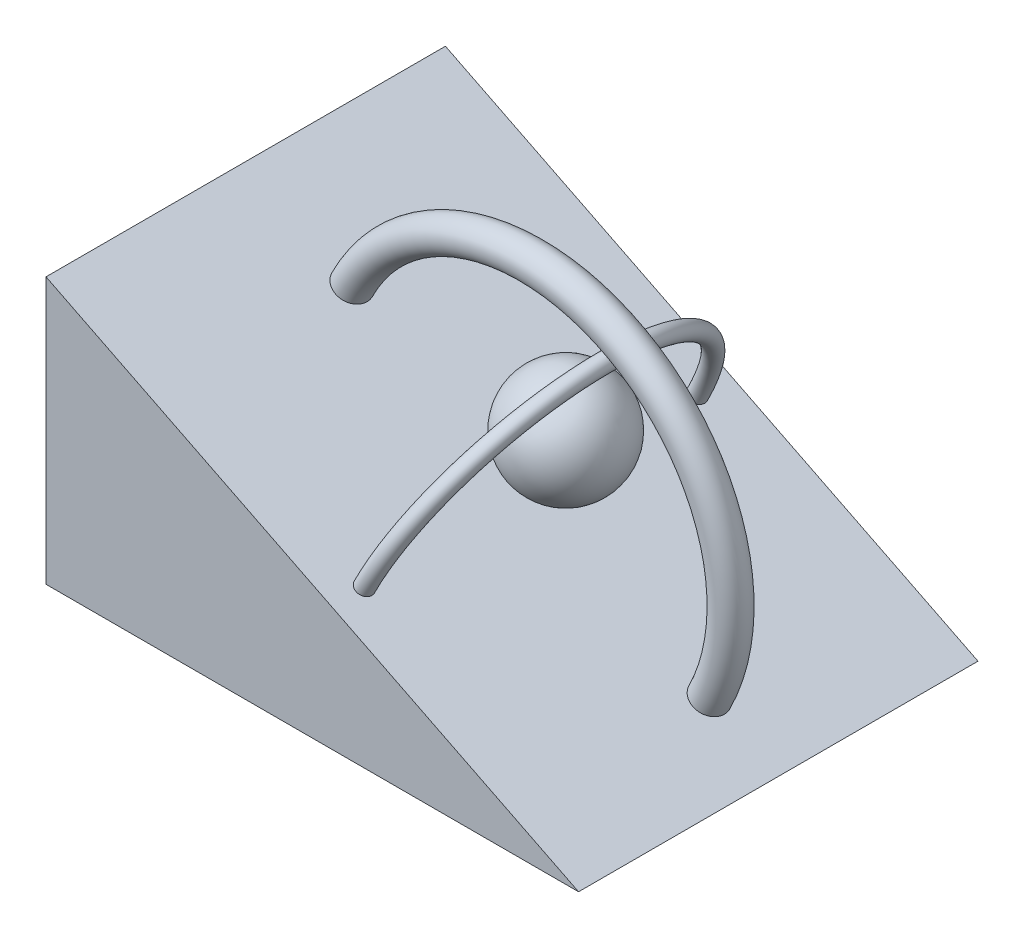
ISO-10303-21;
HEADER;
FILE_DESCRIPTION(('STEP AP214'),'2;1');
FILE_NAME('part.step','',(''),(''),'','','');
FILE_SCHEMA(('AUTOMOTIVE_DESIGN { 1 0 10303 214 1 1 1 1 }'));
ENDSEC;
DATA;
#1=APPLICATION_CONTEXT('core data for automotive mechanical design processes');
#2=APPLICATION_PROTOCOL_DEFINITION('international standard','automotive_design',2000,#1);
#3=PRODUCT_CONTEXT('',#1,'mechanical');
#4=PRODUCT('Part','Part','',(#3));
#5=PRODUCT_RELATED_PRODUCT_CATEGORY('part','',(#4));
#6=PRODUCT_DEFINITION_FORMATION('','',#4);
#7=PRODUCT_DEFINITION_CONTEXT('part definition',#1,'design');
#8=PRODUCT_DEFINITION('design','',#6,#7);
#9=PRODUCT_DEFINITION_SHAPE('','',#8);
#10=(LENGTH_UNIT() NAMED_UNIT(*) SI_UNIT(.MILLI.,.METRE.));
#11=(NAMED_UNIT(*) PLANE_ANGLE_UNIT() SI_UNIT($,.RADIAN.));
#12=(NAMED_UNIT(*) SI_UNIT($,.STERADIAN.) SOLID_ANGLE_UNIT());
#13=UNCERTAINTY_MEASURE_WITH_UNIT(LENGTH_MEASURE(1.E-05),#10,'distance_accuracy_value','');
#14=(GEOMETRIC_REPRESENTATION_CONTEXT(3) GLOBAL_UNCERTAINTY_ASSIGNED_CONTEXT((#13)) GLOBAL_UNIT_ASSIGNED_CONTEXT((#10,
#11,#12)) REPRESENTATION_CONTEXT('',''));
#15=CARTESIAN_POINT('',(0.,0.,0.));
#16=DIRECTION('',(0.,0.,1.));
#17=DIRECTION('',(1.,0.,0.));
#18=AXIS2_PLACEMENT_3D('',#15,#16,#17);
#19=CARTESIAN_POINT('',(61.0517561148393,36.9093222869366,0.));
#20=DIRECTION('',(0.447213595499958,0.894427190999916,0.));
#21=DIRECTION('',(0.,0.,-1.));
#22=AXIS2_PLACEMENT_3D('',#19,#20,#21);
#23=SPHERICAL_SURFACE('',#22,10.5210244842766);
#24=CARTESIAN_POINT('',(57.7247160459681,30.2552421491942,0.));
#25=DIRECTION('',(0.447213595499958,0.894427190999916,0.));
#26=DIRECTION('',(-0.894427190999916,0.447213595499958,0.));
#27=AXIS2_PLACEMENT_3D('',#24,#25,#26);
#28=CIRCLE('',#27,7.4394877578617);
#29=CARTESIAN_POINT('',(51.0706359082256,33.5822822180655,0.));
#30=VERTEX_POINT('',#29);
#31=EDGE_CURVE('E12',#30,#30,#28,.T.);
#32=ORIENTED_EDGE('',*,*,#31,.T.);
#33=EDGE_LOOP('',(#32));
#34=FACE_BOUND('',#33,.T.);
#35=ADVANCED_FACE('F53',(#34),#23,.T.);
#36=CARTESIAN_POINT('',(54.3976759770968,23.6011620114516,0.));
#37=DIRECTION('',(0.447213595499958,0.894427190999916,0.));
#38=DIRECTION('',(-0.894427190999916,0.447213595499958,0.));
#39=AXIS2_PLACEMENT_3D('',#36,#37,#38);
#40=CONICAL_SURFACE('',#39,0.,0.785398163397441);
#41=ORIENTED_EDGE('',*,*,#31,.F.);
#42=EDGE_LOOP('',(#41));
#43=FACE_BOUND('',#42,.T.);
#44=CARTESIAN_POINT('',(54.3976759770968,23.6011620114516,0.));
#45=VERTEX_POINT('',#44);
#46=VERTEX_LOOP('',#45);
#47=FACE_BOUND('',#46,.T.);
#48=ADVANCED_FACE('F60',(#43,#47),#40,.T.);
#49=CLOSED_SHELL('',(#35,#48));
#50=MANIFOLD_SOLID_BREP('B2',#49);
#51=CARTESIAN_POINT('',(101.6,0.,-38.1));
#52=DIRECTION('',(0.,-1.,0.));
#53=DIRECTION('',(0.,0.,-1.));
#54=AXIS2_PLACEMENT_3D('',#51,#52,#53);
#55=PLANE('',#54);
#56=DIRECTION('',(1.,0.,0.));
#57=VECTOR('',#56,1.);
#58=CARTESIAN_POINT('',(101.6,0.,38.1));
#59=LINE('',#58,#57);
#60=CARTESIAN_POINT('',(0.,0.,38.1));
#61=VERTEX_POINT('',#60);
#62=CARTESIAN_POINT('',(101.6,0.,38.1));
#63=VERTEX_POINT('',#62);
#64=EDGE_CURVE('E157',#61,#63,#59,.T.);
#65=ORIENTED_EDGE('',*,*,#64,.F.);
#66=DIRECTION('',(0.,0.,1.));
#67=VECTOR('',#66,1.);
#68=CARTESIAN_POINT('',(0.,0.,-38.1));
#69=LINE('',#68,#67);
#70=CARTESIAN_POINT('',(0.,0.,-38.1));
#71=VERTEX_POINT('',#70);
#72=EDGE_CURVE('E118',#71,#61,#69,.T.);
#73=ORIENTED_EDGE('',*,*,#72,.F.);
#74=DIRECTION('',(1.,0.,0.));
#75=VECTOR('',#74,1.);
#76=CARTESIAN_POINT('',(101.6,0.,-38.1));
#77=LINE('',#76,#75);
#78=CARTESIAN_POINT('',(101.6,0.,-38.1));
#79=VERTEX_POINT('',#78);
#80=EDGE_CURVE('E149',#71,#79,#77,.T.);
#81=ORIENTED_EDGE('',*,*,#80,.T.);
#82=DIRECTION('',(0.,0.,1.));
#83=VECTOR('',#82,1.);
#84=CARTESIAN_POINT('',(101.6,0.,-38.1));
#85=LINE('',#84,#83);
#86=EDGE_CURVE('E138',#79,#63,#85,.T.);
#87=ORIENTED_EDGE('',*,*,#86,.T.);
#88=EDGE_LOOP('',(#65,#73,#81,#87));
#89=FACE_BOUND('',#88,.T.);
#90=ADVANCED_FACE('F102',(#89),#55,.T.);
#91=CARTESIAN_POINT('',(0.,0.,-38.1));
#92=DIRECTION('',(-1.,0.,0.));
#93=DIRECTION('',(0.,0.,1.));
#94=AXIS2_PLACEMENT_3D('',#91,#92,#93);
#95=PLANE('',#94);
#96=DIRECTION('',(0.,-1.,0.));
#97=VECTOR('',#96,1.);
#98=CARTESIAN_POINT('',(0.,0.,38.1));
#99=LINE('',#98,#97);
#100=CARTESIAN_POINT('',(0.,50.8,38.1));
#101=VERTEX_POINT('',#100);
#102=EDGE_CURVE('E151',#101,#61,#99,.T.);
#103=ORIENTED_EDGE('',*,*,#102,.F.);
#104=DIRECTION('',(0.,0.,1.));
#105=VECTOR('',#104,1.);
#106=CARTESIAN_POINT('',(0.,50.8,-38.1));
#107=LINE('',#106,#105);
#108=CARTESIAN_POINT('',(0.,50.8,-38.1));
#109=VERTEX_POINT('',#108);
#110=EDGE_CURVE('E132',#109,#101,#107,.T.);
#111=ORIENTED_EDGE('',*,*,#110,.F.);
#112=DIRECTION('',(0.,-1.,0.));
#113=VECTOR('',#112,1.);
#114=CARTESIAN_POINT('',(0.,0.,-38.1));
#115=LINE('',#114,#113);
#116=EDGE_CURVE('E145',#109,#71,#115,.T.);
#117=ORIENTED_EDGE('',*,*,#116,.T.);
#118=ORIENTED_EDGE('',*,*,#72,.T.);
#119=EDGE_LOOP('',(#103,#111,#117,#118));
#120=FACE_BOUND('',#119,.T.);
#121=ADVANCED_FACE('F174',(#120),#95,.T.);
#122=CARTESIAN_POINT('',(0.,50.8,-38.1));
#123=DIRECTION('',(0.447213595499958,0.894427190999916,0.));
#124=DIRECTION('',(-0.894427190999916,0.447213595499958,0.));
#125=AXIS2_PLACEMENT_3D('',#122,#123,#124);
#126=PLANE('',#125);
#127=CARTESIAN_POINT('',(54.3976759770968,23.6011620114516,-31.75));
#128=DIRECTION('',(0.447213595499958,0.894427190999916,0.));
#129=DIRECTION('',(-0.894427190999916,0.447213595499958,0.));
#130=AXIS2_PLACEMENT_3D('',#127,#128,#129);
#131=CIRCLE('',#130,1.5875);
#132=CARTESIAN_POINT('',(54.3976759770968,23.6011620114516,-33.3375));
#133=VERTEX_POINT('',#132);
#134=EDGE_CURVE('E51',#133,#133,#131,.T.);
#135=ORIENTED_EDGE('',*,*,#134,.F.);
#136=EDGE_LOOP('',(#135));
#137=FACE_BOUND('',#136,.T.);
#138=CARTESIAN_POINT('',(54.3976759770968,23.6011620114516,31.75));
#139=DIRECTION('',(0.447213595499958,0.894427190999916,0.));
#140=DIRECTION('',(-0.894427190999916,0.447213595499958,0.));
#141=AXIS2_PLACEMENT_3D('',#138,#139,#140);
#142=CIRCLE('',#141,1.5875);
#143=CARTESIAN_POINT('',(54.3976759770968,23.6011620114516,33.3375));
#144=VERTEX_POINT('',#143);
#145=EDGE_CURVE('E110',#144,#144,#142,.T.);
#146=ORIENTED_EDGE('',*,*,#145,.F.);
#147=EDGE_LOOP('',(#146));
#148=FACE_BOUND('',#147,.T.);
#149=CARTESIAN_POINT('',(88.4753519541936,6.5623240229032,0.));
#150=DIRECTION('',(0.447213595499958,0.894427190999916,0.));
#151=DIRECTION('',(-0.894427190999916,0.447213595499958,0.));
#152=AXIS2_PLACEMENT_3D('',#149,#150,#151);
#153=CIRCLE('',#152,3.175);
#154=CARTESIAN_POINT('',(91.3151582856183,5.14242085719084,0.));
#155=VERTEX_POINT('',#154);
#156=EDGE_CURVE('E165',#155,#155,#153,.T.);
#157=ORIENTED_EDGE('',*,*,#156,.F.);
#158=EDGE_LOOP('',(#157));
#159=FACE_BOUND('',#158,.T.);
#160=CARTESIAN_POINT('',(20.32,40.64,0.));
#161=DIRECTION('',(0.447213595499958,0.894427190999916,0.));
#162=DIRECTION('',(-0.894427190999916,0.447213595499958,0.));
#163=AXIS2_PLACEMENT_3D('',#160,#161,#162);
#164=CIRCLE('',#163,3.175);
#165=CARTESIAN_POINT('',(17.4801936685753,42.0599031657124,0.));
#166=VERTEX_POINT('',#165);
#167=EDGE_CURVE('E161',#166,#166,#164,.T.);
#168=ORIENTED_EDGE('',*,*,#167,.F.);
#169=EDGE_LOOP('',(#168));
#170=FACE_BOUND('',#169,.T.);
#171=DIRECTION('',(-0.894427190999916,0.447213595499958,0.));
#172=VECTOR('',#171,1.);
#173=CARTESIAN_POINT('',(0.,50.8,38.1));
#174=LINE('',#173,#172);
#175=EDGE_CURVE('E143',#63,#101,#174,.T.);
#176=ORIENTED_EDGE('',*,*,#175,.F.);
#177=ORIENTED_EDGE('',*,*,#86,.F.);
#178=DIRECTION('',(-0.894427190999916,0.447213595499958,0.));
#179=VECTOR('',#178,1.);
#180=CARTESIAN_POINT('',(0.,50.8,-38.1));
#181=LINE('',#180,#179);
#182=EDGE_CURVE('E141',#79,#109,#181,.T.);
#183=ORIENTED_EDGE('',*,*,#182,.T.);
#184=ORIENTED_EDGE('',*,*,#110,.T.);
#185=EDGE_LOOP('',(#176,#177,#183,#184));
#186=FACE_BOUND('',#185,.T.);
#187=ADVANCED_FACE('F140',(#137,#148,#159,#170,#186),#126,.T.);
#188=CARTESIAN_POINT('',(0.,0.,-38.1));
#189=DIRECTION('',(0.,0.,-1.));
#190=DIRECTION('',(-1.,0.,0.));
#191=AXIS2_PLACEMENT_3D('',#188,#189,#190);
#192=PLANE('',#191);
#193=ORIENTED_EDGE('',*,*,#80,.F.);
#194=ORIENTED_EDGE('',*,*,#116,.F.);
#195=ORIENTED_EDGE('',*,*,#182,.F.);
#196=EDGE_LOOP('',(#193,#194,#195));
#197=FACE_BOUND('',#196,.T.);
#198=ADVANCED_FACE('F148',(#197),#192,.T.);
#199=CARTESIAN_POINT('',(0.,0.,38.1));
#200=DIRECTION('',(0.,0.,-1.));
#201=DIRECTION('',(-1.,0.,0.));
#202=AXIS2_PLACEMENT_3D('',#199,#200,#201);
#203=PLANE('',#202);
#204=ORIENTED_EDGE('',*,*,#64,.T.);
#205=ORIENTED_EDGE('',*,*,#175,.T.);
#206=ORIENTED_EDGE('',*,*,#102,.T.);
#207=EDGE_LOOP('',(#204,#205,#206));
#208=FACE_BOUND('',#207,.T.);
#209=ADVANCED_FACE('F182',(#208),#203,.F.);
#210=CARTESIAN_POINT('',(54.3976759770968,23.6011620114516,0.));
#211=DIRECTION('',(0.,0.,-1.));
#212=DIRECTION('',(-1.,0.,0.));
#213=AXIS2_PLACEMENT_3D('',#210,#211,#212);
#214=TOROIDAL_SURFACE('',#213,38.1,3.175);
#215=CARTESIAN_POINT('',(54.3976759770968,23.6011620114516,0.));
#216=DIRECTION('',(0.,0.,-1.));
#217=DIRECTION('',(-1.,0.,0.));
#218=AXIS2_PLACEMENT_3D('',#215,#216,#217);
#219=CIRCLE('',#218,41.275);
#220=EDGE_CURVE('',#166,#155,#219,.T.);
#221=ORIENTED_EDGE('',*,*,#167,.T.);
#222=ORIENTED_EDGE('',*,*,#156,.T.);
#223=ORIENTED_EDGE('',*,*,#220,.T.);
#224=ORIENTED_EDGE('',*,*,#220,.F.);
#225=EDGE_LOOP('',(#221,#223,#222,#224));
#226=FACE_BOUND('',#225,.T.);
#227=ADVANCED_FACE('F180',(#226),#214,.T.);
#228=CARTESIAN_POINT('',(54.3976759770968,23.6011620114516,0.));
#229=DIRECTION('',(-0.894427190999916,0.447213595499958,0.));
#230=DIRECTION('',(-0.447213595499958,-0.894427190999916,0.));
#231=AXIS2_PLACEMENT_3D('',#228,#229,#230);
#232=TOROIDAL_SURFACE('',#231,31.75,1.5875);
#233=CARTESIAN_POINT('',(54.3976759770968,23.6011620114516,0.));
#234=DIRECTION('',(-0.894427190999916,0.447213595499958,0.));
#235=DIRECTION('',(-0.447213595499958,-0.894427190999916,0.));
#236=AXIS2_PLACEMENT_3D('',#233,#234,#235);
#237=CIRCLE('',#236,33.3375);
#238=EDGE_CURVE('',#144,#133,#237,.T.);
#239=ORIENTED_EDGE('',*,*,#145,.T.);
#240=ORIENTED_EDGE('',*,*,#134,.T.);
#241=ORIENTED_EDGE('',*,*,#238,.T.);
#242=ORIENTED_EDGE('',*,*,#238,.F.);
#243=EDGE_LOOP('',(#239,#241,#240,#242));
#244=FACE_BOUND('',#243,.T.);
#245=ADVANCED_FACE('F170',(#244),#232,.T.);
#246=CLOSED_SHELL('',(#90,#121,#187,#198,#209,#227,#245));
#247=MANIFOLD_SOLID_BREP('B6',#246);
#248=ADVANCED_BREP_SHAPE_REPRESENTATION('',(#18,#50,#247),#14);
#249=SHAPE_DEFINITION_REPRESENTATION(#9,#248);
ENDSEC;
END-ISO-10303-21;
